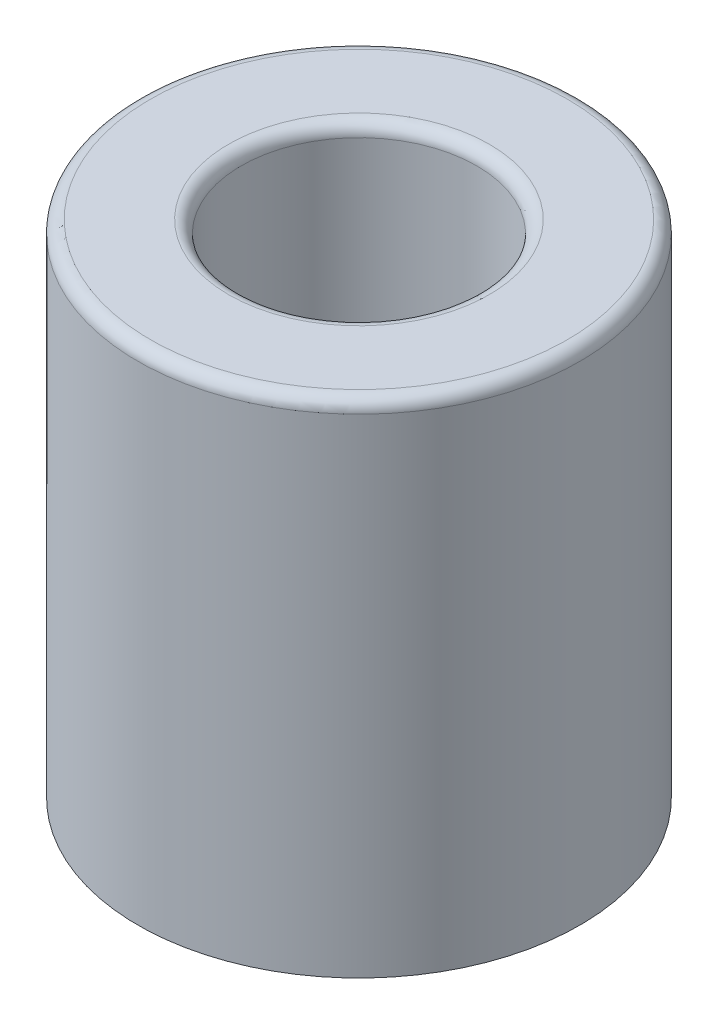
ISO-10303-21;
HEADER;
FILE_DESCRIPTION(('STEP AP214'),'2;1');
FILE_NAME('part.step','',(''),(''),'','','');
FILE_SCHEMA(('AUTOMOTIVE_DESIGN { 1 0 10303 214 1 1 1 1 }'));
ENDSEC;
DATA;
#1=APPLICATION_CONTEXT('core data for automotive mechanical design processes');
#2=APPLICATION_PROTOCOL_DEFINITION('international standard','automotive_design',2000,#1);
#3=PRODUCT_CONTEXT('',#1,'mechanical');
#4=PRODUCT('Part','Part','',(#3));
#5=PRODUCT_RELATED_PRODUCT_CATEGORY('part','',(#4));
#6=PRODUCT_DEFINITION_FORMATION('','',#4);
#7=PRODUCT_DEFINITION_CONTEXT('part definition',#1,'design');
#8=PRODUCT_DEFINITION('design','',#6,#7);
#9=PRODUCT_DEFINITION_SHAPE('','',#8);
#10=(LENGTH_UNIT() NAMED_UNIT(*) SI_UNIT(.MILLI.,.METRE.));
#11=(NAMED_UNIT(*) PLANE_ANGLE_UNIT() SI_UNIT($,.RADIAN.));
#12=(NAMED_UNIT(*) SI_UNIT($,.STERADIAN.) SOLID_ANGLE_UNIT());
#13=UNCERTAINTY_MEASURE_WITH_UNIT(LENGTH_MEASURE(1.E-05),#10,'distance_accuracy_value','');
#14=(GEOMETRIC_REPRESENTATION_CONTEXT(3) GLOBAL_UNCERTAINTY_ASSIGNED_CONTEXT((#13)) GLOBAL_UNIT_ASSIGNED_CONTEXT((#10,
#11,#12)) REPRESENTATION_CONTEXT('',''));
#15=CARTESIAN_POINT('',(0.,0.,0.));
#16=DIRECTION('',(0.,0.,1.));
#17=DIRECTION('',(1.,0.,0.));
#18=AXIS2_PLACEMENT_3D('',#15,#16,#17);
#19=CARTESIAN_POINT('',(-1.7859375,0.,0.));
#20=DIRECTION('',(0.,1.,0.));
#21=DIRECTION('',(0.,0.,1.));
#22=AXIS2_PLACEMENT_3D('',#19,#20,#21);
#23=PLANE('',#22);
#24=CARTESIAN_POINT('',(0.,0.,0.));
#25=DIRECTION('',(0.,-1.,0.));
#26=DIRECTION('',(0.,0.,-1.));
#27=AXIS2_PLACEMENT_3D('',#24,#25,#26);
#28=CIRCLE('',#27,1.7859375);
#29=CARTESIAN_POINT('',(0.,0.,-1.7859375));
#30=VERTEX_POINT('',#29);
#31=EDGE_CURVE('E43',#30,#30,#28,.T.);
#32=ORIENTED_EDGE('',*,*,#31,.F.);
#33=EDGE_LOOP('',(#32));
#34=FACE_BOUND('',#33,.T.);
#35=CARTESIAN_POINT('',(0.,0.,0.));
#36=DIRECTION('',(0.,-1.,0.));
#37=DIRECTION('',(0.,0.,-1.));
#38=AXIS2_PLACEMENT_3D('',#35,#36,#37);
#39=CIRCLE('',#38,5.953125);
#40=CARTESIAN_POINT('',(0.,0.,-5.953125));
#41=VERTEX_POINT('',#40);
#42=EDGE_CURVE('E61',#41,#41,#39,.T.);
#43=ORIENTED_EDGE('',*,*,#42,.T.);
#44=EDGE_LOOP('',(#43));
#45=FACE_BOUND('',#44,.T.);
#46=ADVANCED_FACE('F32',(#34,#45),#23,.F.);
#47=CARTESIAN_POINT('',(0.,0.,0.));
#48=DIRECTION('',(0.,-1.,0.));
#49=DIRECTION('',(0.,0.,-1.));
#50=AXIS2_PLACEMENT_3D('',#47,#48,#49);
#51=CYLINDRICAL_SURFACE('',#50,1.7859375);
#52=CARTESIAN_POINT('',(0.,4.7625,0.));
#53=DIRECTION('',(0.,-1.,0.));
#54=DIRECTION('',(0.,0.,-1.));
#55=AXIS2_PLACEMENT_3D('',#52,#53,#54);
#56=CIRCLE('',#55,1.7859375);
#57=CARTESIAN_POINT('',(0.,4.7625,-1.7859375));
#58=VERTEX_POINT('',#57);
#59=EDGE_CURVE('E47',#58,#58,#56,.T.);
#60=ORIENTED_EDGE('',*,*,#59,.F.);
#61=EDGE_LOOP('',(#60));
#62=FACE_BOUND('',#61,.T.);
#63=ORIENTED_EDGE('',*,*,#31,.T.);
#64=EDGE_LOOP('',(#63));
#65=FACE_BOUND('',#64,.T.);
#66=ADVANCED_FACE('F88',(#62,#65),#51,.F.);
#67=CARTESIAN_POINT('',(-3.175,4.7625,0.));
#68=DIRECTION('',(0.,-1.,0.));
#69=DIRECTION('',(0.,0.,-1.));
#70=AXIS2_PLACEMENT_3D('',#67,#68,#69);
#71=PLANE('',#70);
#72=CARTESIAN_POINT('',(0.,4.7625,0.));
#73=DIRECTION('',(0.,-1.,0.));
#74=DIRECTION('',(0.,0.,-1.));
#75=AXIS2_PLACEMENT_3D('',#72,#73,#74);
#76=CIRCLE('',#75,3.175);
#77=CARTESIAN_POINT('',(0.,4.7625,-3.175));
#78=VERTEX_POINT('',#77);
#79=EDGE_CURVE('E52',#78,#78,#76,.T.);
#80=ORIENTED_EDGE('',*,*,#79,.F.);
#81=EDGE_LOOP('',(#80));
#82=FACE_BOUND('',#81,.T.);
#83=ORIENTED_EDGE('',*,*,#59,.T.);
#84=EDGE_LOOP('',(#83));
#85=FACE_BOUND('',#84,.T.);
#86=ADVANCED_FACE('F85',(#82,#85),#71,.F.);
#87=CARTESIAN_POINT('',(0.,0.,0.));
#88=DIRECTION('',(0.,-1.,0.));
#89=DIRECTION('',(0.,0.,-1.));
#90=AXIS2_PLACEMENT_3D('',#87,#88,#89);
#91=CYLINDRICAL_SURFACE('',#90,3.175);
#92=CARTESIAN_POINT('',(0.,13.15640625,0.));
#93=DIRECTION('',(0.,-1.,0.));
#94=DIRECTION('',(0.,0.,-1.));
#95=AXIS2_PLACEMENT_3D('',#92,#93,#94);
#96=CIRCLE('',#95,3.175);
#97=CARTESIAN_POINT('',(0.,13.15640625,-3.175));
#98=VERTEX_POINT('',#97);
#99=EDGE_CURVE('E10',#98,#98,#96,.F.);
#100=ORIENTED_EDGE('',*,*,#99,.T.);
#101=EDGE_LOOP('',(#100));
#102=FACE_BOUND('',#101,.T.);
#103=ORIENTED_EDGE('',*,*,#79,.T.);
#104=EDGE_LOOP('',(#103));
#105=FACE_BOUND('',#104,.T.);
#106=ADVANCED_FACE('F80',(#102,#105),#91,.F.);
#107=CARTESIAN_POINT('',(-5.61578125,13.49375,0.));
#108=DIRECTION('',(0.,-1.,0.));
#109=DIRECTION('',(0.,0.,-1.));
#110=AXIS2_PLACEMENT_3D('',#107,#108,#109);
#111=PLANE('',#110);
#112=CARTESIAN_POINT('',(0.,13.49375,0.));
#113=DIRECTION('',(0.,-1.,0.));
#114=DIRECTION('',(0.,0.,-1.));
#115=AXIS2_PLACEMENT_3D('',#112,#113,#114);
#116=CIRCLE('',#115,3.51234375);
#117=CARTESIAN_POINT('',(0.,13.49375,-3.51234375));
#118=VERTEX_POINT('',#117);
#119=EDGE_CURVE('E39',#118,#118,#116,.T.);
#120=ORIENTED_EDGE('',*,*,#119,.T.);
#121=EDGE_LOOP('',(#120));
#122=FACE_BOUND('',#121,.T.);
#123=CARTESIAN_POINT('',(0.,13.49375,0.));
#124=DIRECTION('',(0.,-1.,0.));
#125=DIRECTION('',(0.,0.,-1.));
#126=AXIS2_PLACEMENT_3D('',#123,#124,#125);
#127=CIRCLE('',#126,5.61578125);
#128=CARTESIAN_POINT('',(0.,13.49375,-5.61578125));
#129=VERTEX_POINT('',#128);
#130=EDGE_CURVE('E55',#129,#129,#127,.T.);
#131=ORIENTED_EDGE('',*,*,#130,.F.);
#132=EDGE_LOOP('',(#131));
#133=FACE_BOUND('',#132,.T.);
#134=ADVANCED_FACE('F75',(#122,#133),#111,.F.);
#135=CARTESIAN_POINT('',(0.,13.15640625,0.));
#136=DIRECTION('',(0.,-1.,0.));
#137=DIRECTION('',(0.,0.,-1.));
#138=AXIS2_PLACEMENT_3D('',#135,#136,#137);
#139=TOROIDAL_SURFACE('',#138,5.61578125,0.33734375);
#140=CARTESIAN_POINT('',(0.,13.15640625,0.));
#141=DIRECTION('',(0.,-1.,0.));
#142=DIRECTION('',(0.,0.,-1.));
#143=AXIS2_PLACEMENT_3D('',#140,#141,#142);
#144=CIRCLE('',#143,5.953125);
#145=CARTESIAN_POINT('',(0.,13.15640625,-5.953125));
#146=VERTEX_POINT('',#145);
#147=EDGE_CURVE('E58',#146,#146,#144,.T.);
#148=ORIENTED_EDGE('',*,*,#147,.F.);
#149=EDGE_LOOP('',(#148));
#150=FACE_BOUND('',#149,.T.);
#151=ORIENTED_EDGE('',*,*,#130,.T.);
#152=EDGE_LOOP('',(#151));
#153=FACE_BOUND('',#152,.T.);
#154=ADVANCED_FACE('F69',(#150,#153),#139,.T.);
#155=CARTESIAN_POINT('',(0.,0.,0.));
#156=DIRECTION('',(0.,-1.,0.));
#157=DIRECTION('',(0.,0.,-1.));
#158=AXIS2_PLACEMENT_3D('',#155,#156,#157);
#159=CYLINDRICAL_SURFACE('',#158,5.953125);
#160=ORIENTED_EDGE('',*,*,#42,.F.);
#161=EDGE_LOOP('',(#160));
#162=FACE_BOUND('',#161,.T.);
#163=ORIENTED_EDGE('',*,*,#147,.T.);
#164=EDGE_LOOP('',(#163));
#165=FACE_BOUND('',#164,.T.);
#166=ADVANCED_FACE('F66',(#162,#165),#159,.T.);
#167=CARTESIAN_POINT('',(0.,13.15640625,0.));
#168=DIRECTION('',(0.,-1.,0.));
#169=DIRECTION('',(0.,0.,-1.));
#170=AXIS2_PLACEMENT_3D('',#167,#168,#169);
#171=TOROIDAL_SURFACE('',#170,3.51234375,0.33734375);
#172=ORIENTED_EDGE('',*,*,#99,.F.);
#173=EDGE_LOOP('',(#172));
#174=FACE_BOUND('',#173,.T.);
#175=ORIENTED_EDGE('',*,*,#119,.F.);
#176=EDGE_LOOP('',(#175));
#177=FACE_BOUND('',#176,.T.);
#178=ADVANCED_FACE('F34',(#174,#177),#171,.T.);
#179=CLOSED_SHELL('',(#46,#66,#86,#106,#134,#154,#166,#178));
#180=MANIFOLD_SOLID_BREP('B2',#179);
#181=ADVANCED_BREP_SHAPE_REPRESENTATION('',(#18,#180),#14);
#182=SHAPE_DEFINITION_REPRESENTATION(#9,#181);
ENDSEC;
END-ISO-10303-21;
